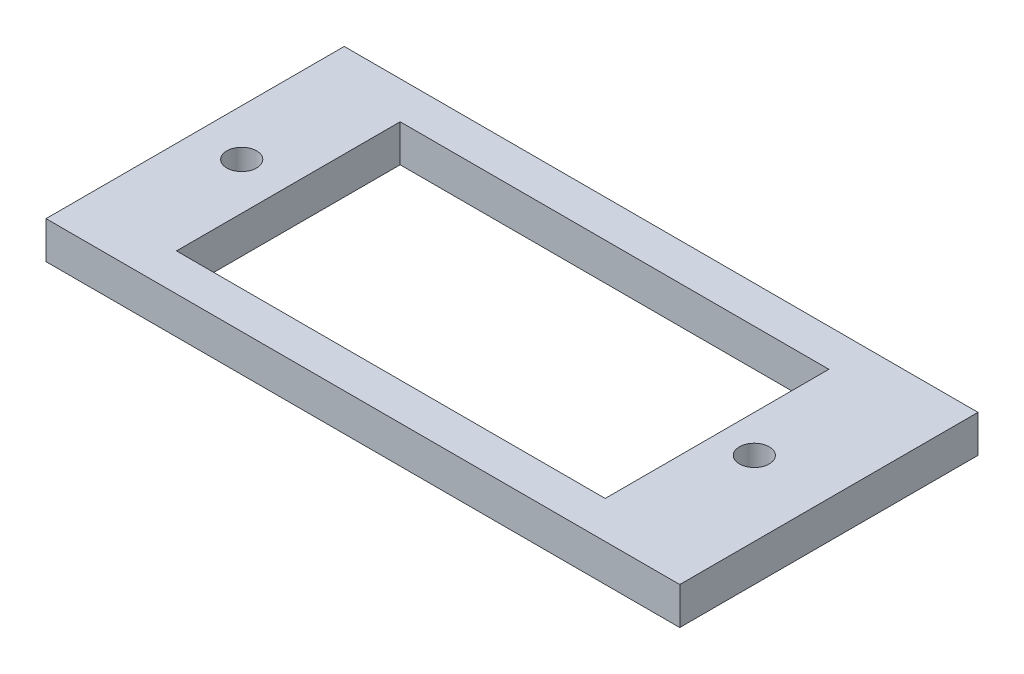
ISO-10303-21;
HEADER;
FILE_DESCRIPTION(('STEP AP214'),'2;1');
FILE_NAME('part.step','',(''),(''),'','','');
FILE_SCHEMA(('AUTOMOTIVE_DESIGN { 1 0 10303 214 1 1 1 1 }'));
ENDSEC;
DATA;
#1=APPLICATION_CONTEXT('core data for automotive mechanical design processes');
#2=APPLICATION_PROTOCOL_DEFINITION('international standard','automotive_design',2000,#1);
#3=PRODUCT_CONTEXT('',#1,'mechanical');
#4=PRODUCT('Part','Part','',(#3));
#5=PRODUCT_RELATED_PRODUCT_CATEGORY('part','',(#4));
#6=PRODUCT_DEFINITION_FORMATION('','',#4);
#7=PRODUCT_DEFINITION_CONTEXT('part definition',#1,'design');
#8=PRODUCT_DEFINITION('design','',#6,#7);
#9=PRODUCT_DEFINITION_SHAPE('','',#8);
#10=(LENGTH_UNIT() NAMED_UNIT(*) SI_UNIT(.MILLI.,.METRE.));
#11=(NAMED_UNIT(*) PLANE_ANGLE_UNIT() SI_UNIT($,.RADIAN.));
#12=(NAMED_UNIT(*) SI_UNIT($,.STERADIAN.) SOLID_ANGLE_UNIT());
#13=UNCERTAINTY_MEASURE_WITH_UNIT(LENGTH_MEASURE(1.E-05),#10,'distance_accuracy_value','');
#14=(GEOMETRIC_REPRESENTATION_CONTEXT(3) GLOBAL_UNCERTAINTY_ASSIGNED_CONTEXT((#13)) GLOBAL_UNIT_ASSIGNED_CONTEXT((#10,
#11,#12)) REPRESENTATION_CONTEXT('',''));
#15=CARTESIAN_POINT('',(0.,0.,0.));
#16=DIRECTION('',(0.,0.,1.));
#17=DIRECTION('',(1.,0.,0.));
#18=AXIS2_PLACEMENT_3D('',#15,#16,#17);
#19=CARTESIAN_POINT('',(-17.,2.,8.));
#20=DIRECTION('',(1.,0.,0.));
#21=DIRECTION('',(0.,0.,-1.));
#22=AXIS2_PLACEMENT_3D('',#19,#20,#21);
#23=PLANE('',#22);
#24=DIRECTION('',(0.,0.,1.));
#25=VECTOR('',#24,1.);
#26=CARTESIAN_POINT('',(-17.,0.,8.));
#27=LINE('',#26,#25);
#28=CARTESIAN_POINT('',(-17.,0.,-8.));
#29=VERTEX_POINT('',#28);
#30=CARTESIAN_POINT('',(-17.,0.,8.));
#31=VERTEX_POINT('',#30);
#32=EDGE_CURVE('E139',#29,#31,#27,.T.);
#33=ORIENTED_EDGE('',*,*,#32,.T.);
#34=DIRECTION('',(0.,-1.,0.));
#35=VECTOR('',#34,1.);
#36=CARTESIAN_POINT('',(-17.,2.,8.));
#37=LINE('',#36,#35);
#38=CARTESIAN_POINT('',(-17.,2.,8.));
#39=VERTEX_POINT('',#38);
#40=EDGE_CURVE('E11',#39,#31,#37,.T.);
#41=ORIENTED_EDGE('',*,*,#40,.F.);
#42=DIRECTION('',(0.,0.,1.));
#43=VECTOR('',#42,1.);
#44=CARTESIAN_POINT('',(-17.,2.,8.));
#45=LINE('',#44,#43);
#46=CARTESIAN_POINT('',(-17.,2.,-8.));
#47=VERTEX_POINT('',#46);
#48=EDGE_CURVE('E140',#47,#39,#45,.T.);
#49=ORIENTED_EDGE('',*,*,#48,.F.);
#50=DIRECTION('',(0.,-1.,0.));
#51=VECTOR('',#50,1.);
#52=CARTESIAN_POINT('',(-17.,2.,-8.));
#53=LINE('',#52,#51);
#54=EDGE_CURVE('E150',#47,#29,#53,.T.);
#55=ORIENTED_EDGE('',*,*,#54,.T.);
#56=EDGE_LOOP('',(#33,#41,#49,#55));
#57=FACE_BOUND('',#56,.T.);
#58=ADVANCED_FACE('F34',(#57),#23,.F.);
#59=CARTESIAN_POINT('',(17.,2.,8.));
#60=DIRECTION('',(0.,0.,-1.));
#61=DIRECTION('',(-1.,0.,0.));
#62=AXIS2_PLACEMENT_3D('',#59,#60,#61);
#63=PLANE('',#62);
#64=DIRECTION('',(1.,0.,0.));
#65=VECTOR('',#64,1.);
#66=CARTESIAN_POINT('',(17.,0.,8.));
#67=LINE('',#66,#65);
#68=CARTESIAN_POINT('',(17.,0.,8.));
#69=VERTEX_POINT('',#68);
#70=EDGE_CURVE('E153',#31,#69,#67,.T.);
#71=ORIENTED_EDGE('',*,*,#70,.T.);
#72=DIRECTION('',(0.,-1.,0.));
#73=VECTOR('',#72,1.);
#74=CARTESIAN_POINT('',(17.,2.,8.));
#75=LINE('',#74,#73);
#76=CARTESIAN_POINT('',(17.,2.,8.));
#77=VERTEX_POINT('',#76);
#78=EDGE_CURVE('E41',#77,#69,#75,.T.);
#79=ORIENTED_EDGE('',*,*,#78,.F.);
#80=DIRECTION('',(1.,0.,0.));
#81=VECTOR('',#80,1.);
#82=CARTESIAN_POINT('',(17.,2.,8.));
#83=LINE('',#82,#81);
#84=EDGE_CURVE('E143',#39,#77,#83,.T.);
#85=ORIENTED_EDGE('',*,*,#84,.F.);
#86=ORIENTED_EDGE('',*,*,#40,.T.);
#87=EDGE_LOOP('',(#71,#79,#85,#86));
#88=FACE_BOUND('',#87,.T.);
#89=ADVANCED_FACE('F181',(#88),#63,.F.);
#90=CARTESIAN_POINT('',(17.,2.,8.));
#91=DIRECTION('',(-1.,0.,0.));
#92=DIRECTION('',(0.,0.,1.));
#93=AXIS2_PLACEMENT_3D('',#90,#91,#92);
#94=PLANE('',#93);
#95=DIRECTION('',(0.,0.,-1.));
#96=VECTOR('',#95,1.);
#97=CARTESIAN_POINT('',(17.,0.,8.));
#98=LINE('',#97,#96);
#99=CARTESIAN_POINT('',(17.,0.,-8.));
#100=VERTEX_POINT('',#99);
#101=EDGE_CURVE('E155',#69,#100,#98,.T.);
#102=ORIENTED_EDGE('',*,*,#101,.T.);
#103=DIRECTION('',(0.,-1.,0.));
#104=VECTOR('',#103,1.);
#105=CARTESIAN_POINT('',(17.,2.,-8.));
#106=LINE('',#105,#104);
#107=CARTESIAN_POINT('',(17.,2.,-8.));
#108=VERTEX_POINT('',#107);
#109=EDGE_CURVE('E160',#108,#100,#106,.T.);
#110=ORIENTED_EDGE('',*,*,#109,.F.);
#111=DIRECTION('',(0.,0.,-1.));
#112=VECTOR('',#111,1.);
#113=CARTESIAN_POINT('',(17.,2.,8.));
#114=LINE('',#113,#112);
#115=EDGE_CURVE('E146',#77,#108,#114,.T.);
#116=ORIENTED_EDGE('',*,*,#115,.F.);
#117=ORIENTED_EDGE('',*,*,#78,.T.);
#118=EDGE_LOOP('',(#102,#110,#116,#117));
#119=FACE_BOUND('',#118,.T.);
#120=ADVANCED_FACE('F167',(#119),#94,.F.);
#121=CARTESIAN_POINT('',(17.,2.,-8.));
#122=DIRECTION('',(0.,0.,1.));
#123=DIRECTION('',(1.,0.,0.));
#124=AXIS2_PLACEMENT_3D('',#121,#122,#123);
#125=PLANE('',#124);
#126=DIRECTION('',(-1.,0.,0.));
#127=VECTOR('',#126,1.);
#128=CARTESIAN_POINT('',(17.,0.,-8.));
#129=LINE('',#128,#127);
#130=EDGE_CURVE('E144',#100,#29,#129,.T.);
#131=ORIENTED_EDGE('',*,*,#130,.T.);
#132=ORIENTED_EDGE('',*,*,#54,.F.);
#133=DIRECTION('',(-1.,0.,0.));
#134=VECTOR('',#133,1.);
#135=CARTESIAN_POINT('',(17.,2.,-8.));
#136=LINE('',#135,#134);
#137=EDGE_CURVE('E148',#108,#47,#136,.T.);
#138=ORIENTED_EDGE('',*,*,#137,.F.);
#139=ORIENTED_EDGE('',*,*,#109,.T.);
#140=EDGE_LOOP('',(#131,#132,#138,#139));
#141=FACE_BOUND('',#140,.T.);
#142=ADVANCED_FACE('F174',(#141),#125,.F.);
#143=CARTESIAN_POINT('',(0.,2.,0.));
#144=DIRECTION('',(0.,1.,0.));
#145=DIRECTION('',(0.,0.,1.));
#146=AXIS2_PLACEMENT_3D('',#143,#144,#145);
#147=PLANE('',#146);
#148=CARTESIAN_POINT('',(12.9999999999999,2.,0.));
#149=DIRECTION('',(0.,1.,0.));
#150=DIRECTION('',(0.,0.,1.));
#151=AXIS2_PLACEMENT_3D('',#148,#149,#150);
#152=CIRCLE('',#151,0.800000000000001);
#153=CARTESIAN_POINT('',(12.9999999999999,2.,0.800000000000001));
#154=VERTEX_POINT('',#153);
#155=EDGE_CURVE('E220',#154,#154,#152,.T.);
#156=ORIENTED_EDGE('',*,*,#155,.F.);
#157=EDGE_LOOP('',(#156));
#158=FACE_BOUND('',#157,.T.);
#159=CARTESIAN_POINT('',(-14.5,2.,0.));
#160=DIRECTION('',(0.,1.,0.));
#161=DIRECTION('',(0.,0.,1.));
#162=AXIS2_PLACEMENT_3D('',#159,#160,#161);
#163=CIRCLE('',#162,0.800000000000001);
#164=CARTESIAN_POINT('',(-14.5,2.,0.800000000000001));
#165=VERTEX_POINT('',#164);
#166=EDGE_CURVE('E117',#165,#165,#163,.T.);
#167=ORIENTED_EDGE('',*,*,#166,.F.);
#168=EDGE_LOOP('',(#167));
#169=FACE_BOUND('',#168,.T.);
#170=DIRECTION('',(0.,0.,1.));
#171=VECTOR('',#170,1.);
#172=CARTESIAN_POINT('',(-12.,2.,0.));
#173=LINE('',#172,#171);
#174=CARTESIAN_POINT('',(-12.,2.,-6.00000000000006));
#175=VERTEX_POINT('',#174);
#176=CARTESIAN_POINT('',(-12.,2.,5.99999999999994));
#177=VERTEX_POINT('',#176);
#178=EDGE_CURVE('E104',#175,#177,#173,.T.);
#179=ORIENTED_EDGE('',*,*,#178,.F.);
#180=DIRECTION('',(-1.,0.,0.));
#181=VECTOR('',#180,1.);
#182=CARTESIAN_POINT('',(0.,2.,-6.00000000000006));
#183=LINE('',#182,#181);
#184=CARTESIAN_POINT('',(11.,2.,-6.00000000000006));
#185=VERTEX_POINT('',#184);
#186=EDGE_CURVE('E136',#185,#175,#183,.T.);
#187=ORIENTED_EDGE('',*,*,#186,.F.);
#188=DIRECTION('',(0.,0.,-1.));
#189=VECTOR('',#188,1.);
#190=CARTESIAN_POINT('',(11.,2.,0.));
#191=LINE('',#190,#189);
#192=CARTESIAN_POINT('',(11.,2.,5.99999999999994));
#193=VERTEX_POINT('',#192);
#194=EDGE_CURVE('E134',#193,#185,#191,.T.);
#195=ORIENTED_EDGE('',*,*,#194,.F.);
#196=DIRECTION('',(1.,0.,0.));
#197=VECTOR('',#196,1.);
#198=CARTESIAN_POINT('',(0.,2.,5.99999999999994));
#199=LINE('',#198,#197);
#200=EDGE_CURVE('E128',#177,#193,#199,.T.);
#201=ORIENTED_EDGE('',*,*,#200,.F.);
#202=EDGE_LOOP('',(#179,#187,#195,#201));
#203=FACE_BOUND('',#202,.T.);
#204=ORIENTED_EDGE('',*,*,#48,.T.);
#205=ORIENTED_EDGE('',*,*,#84,.T.);
#206=ORIENTED_EDGE('',*,*,#115,.T.);
#207=ORIENTED_EDGE('',*,*,#137,.T.);
#208=EDGE_LOOP('',(#204,#205,#206,#207));
#209=FACE_BOUND('',#208,.T.);
#210=ADVANCED_FACE('F180',(#158,#169,#203,#209),#147,.T.);
#211=CARTESIAN_POINT('',(0.,0.,0.));
#212=DIRECTION('',(0.,1.,0.));
#213=DIRECTION('',(0.,0.,1.));
#214=AXIS2_PLACEMENT_3D('',#211,#212,#213);
#215=PLANE('',#214);
#216=CARTESIAN_POINT('',(12.9999999999999,0.,0.));
#217=DIRECTION('',(0.,1.,0.));
#218=DIRECTION('',(0.,0.,1.));
#219=AXIS2_PLACEMENT_3D('',#216,#217,#218);
#220=CIRCLE('',#219,0.800000000000001);
#221=CARTESIAN_POINT('',(12.9999999999999,0.,0.800000000000001));
#222=VERTEX_POINT('',#221);
#223=EDGE_CURVE('E223',#222,#222,#220,.T.);
#224=ORIENTED_EDGE('',*,*,#223,.T.);
#225=EDGE_LOOP('',(#224));
#226=FACE_BOUND('',#225,.T.);
#227=CARTESIAN_POINT('',(-14.5,0.,0.));
#228=DIRECTION('',(0.,1.,0.));
#229=DIRECTION('',(0.,0.,1.));
#230=AXIS2_PLACEMENT_3D('',#227,#228,#229);
#231=CIRCLE('',#230,0.800000000000001);
#232=CARTESIAN_POINT('',(-14.5,0.,0.800000000000001));
#233=VERTEX_POINT('',#232);
#234=EDGE_CURVE('E120',#233,#233,#231,.T.);
#235=ORIENTED_EDGE('',*,*,#234,.T.);
#236=EDGE_LOOP('',(#235));
#237=FACE_BOUND('',#236,.T.);
#238=DIRECTION('',(-1.,0.,0.));
#239=VECTOR('',#238,1.);
#240=CARTESIAN_POINT('',(11.,0.,-6.00000000000006));
#241=LINE('',#240,#239);
#242=CARTESIAN_POINT('',(11.,0.,-6.00000000000006));
#243=VERTEX_POINT('',#242);
#244=CARTESIAN_POINT('',(-12.,0.,-6.00000000000006));
#245=VERTEX_POINT('',#244);
#246=EDGE_CURVE('E107',#243,#245,#241,.T.);
#247=ORIENTED_EDGE('',*,*,#246,.T.);
#248=DIRECTION('',(0.,0.,1.));
#249=VECTOR('',#248,1.);
#250=CARTESIAN_POINT('',(-12.,0.,5.99999999999994));
#251=LINE('',#250,#249);
#252=CARTESIAN_POINT('',(-12.,0.,5.99999999999994));
#253=VERTEX_POINT('',#252);
#254=EDGE_CURVE('E101',#245,#253,#251,.T.);
#255=ORIENTED_EDGE('',*,*,#254,.T.);
#256=DIRECTION('',(1.,0.,0.));
#257=VECTOR('',#256,1.);
#258=CARTESIAN_POINT('',(11.,0.,5.99999999999994));
#259=LINE('',#258,#257);
#260=CARTESIAN_POINT('',(11.,0.,5.99999999999994));
#261=VERTEX_POINT('',#260);
#262=EDGE_CURVE('E110',#253,#261,#259,.T.);
#263=ORIENTED_EDGE('',*,*,#262,.T.);
#264=DIRECTION('',(0.,0.,-1.));
#265=VECTOR('',#264,1.);
#266=CARTESIAN_POINT('',(11.,0.,5.99999999999994));
#267=LINE('',#266,#265);
#268=EDGE_CURVE('E56',#261,#243,#267,.T.);
#269=ORIENTED_EDGE('',*,*,#268,.T.);
#270=EDGE_LOOP('',(#247,#255,#263,#269));
#271=FACE_BOUND('',#270,.T.);
#272=ORIENTED_EDGE('',*,*,#32,.F.);
#273=ORIENTED_EDGE('',*,*,#130,.F.);
#274=ORIENTED_EDGE('',*,*,#101,.F.);
#275=ORIENTED_EDGE('',*,*,#70,.F.);
#276=EDGE_LOOP('',(#272,#273,#274,#275));
#277=FACE_BOUND('',#276,.T.);
#278=ADVANCED_FACE('F114',(#226,#237,#271,#277),#215,.F.);
#279=CARTESIAN_POINT('',(-12.,0.,5.99999999999994));
#280=DIRECTION('',(-1.,0.,0.));
#281=DIRECTION('',(0.,0.,1.));
#282=AXIS2_PLACEMENT_3D('',#279,#280,#281);
#283=PLANE('',#282);
#284=ORIENTED_EDGE('',*,*,#178,.T.);
#285=DIRECTION('',(0.,1.,0.));
#286=VECTOR('',#285,1.);
#287=CARTESIAN_POINT('',(-12.,0.,5.99999999999994));
#288=LINE('',#287,#286);
#289=EDGE_CURVE('E48',#253,#177,#288,.T.);
#290=ORIENTED_EDGE('',*,*,#289,.F.);
#291=ORIENTED_EDGE('',*,*,#254,.F.);
#292=DIRECTION('',(0.,1.,0.));
#293=VECTOR('',#292,1.);
#294=CARTESIAN_POINT('',(-12.,0.,-6.00000000000006));
#295=LINE('',#294,#293);
#296=EDGE_CURVE('E126',#245,#175,#295,.T.);
#297=ORIENTED_EDGE('',*,*,#296,.T.);
#298=EDGE_LOOP('',(#284,#290,#291,#297));
#299=FACE_BOUND('',#298,.T.);
#300=ADVANCED_FACE('F98',(#299),#283,.F.);
#301=CARTESIAN_POINT('',(11.,0.,-6.00000000000006));
#302=DIRECTION('',(0.,0.,-1.));
#303=DIRECTION('',(-1.,0.,0.));
#304=AXIS2_PLACEMENT_3D('',#301,#302,#303);
#305=PLANE('',#304);
#306=ORIENTED_EDGE('',*,*,#186,.T.);
#307=ORIENTED_EDGE('',*,*,#296,.F.);
#308=ORIENTED_EDGE('',*,*,#246,.F.);
#309=DIRECTION('',(0.,1.,0.));
#310=VECTOR('',#309,1.);
#311=CARTESIAN_POINT('',(11.,0.,-6.00000000000006));
#312=LINE('',#311,#310);
#313=EDGE_CURVE('E129',#243,#185,#312,.T.);
#314=ORIENTED_EDGE('',*,*,#313,.T.);
#315=EDGE_LOOP('',(#306,#307,#308,#314));
#316=FACE_BOUND('',#315,.T.);
#317=ADVANCED_FACE('F199',(#316),#305,.F.);
#318=CARTESIAN_POINT('',(11.,0.,5.99999999999994));
#319=DIRECTION('',(1.,0.,0.));
#320=DIRECTION('',(0.,0.,-1.));
#321=AXIS2_PLACEMENT_3D('',#318,#319,#320);
#322=PLANE('',#321);
#323=ORIENTED_EDGE('',*,*,#194,.T.);
#324=ORIENTED_EDGE('',*,*,#313,.F.);
#325=ORIENTED_EDGE('',*,*,#268,.F.);
#326=DIRECTION('',(0.,1.,0.));
#327=VECTOR('',#326,1.);
#328=CARTESIAN_POINT('',(11.,0.,5.99999999999994));
#329=LINE('',#328,#327);
#330=EDGE_CURVE('E106',#261,#193,#329,.T.);
#331=ORIENTED_EDGE('',*,*,#330,.T.);
#332=EDGE_LOOP('',(#323,#324,#325,#331));
#333=FACE_BOUND('',#332,.T.);
#334=ADVANCED_FACE('F203',(#333),#322,.F.);
#335=CARTESIAN_POINT('',(11.,0.,5.99999999999994));
#336=DIRECTION('',(0.,0.,1.));
#337=DIRECTION('',(1.,0.,0.));
#338=AXIS2_PLACEMENT_3D('',#335,#336,#337);
#339=PLANE('',#338);
#340=ORIENTED_EDGE('',*,*,#200,.T.);
#341=ORIENTED_EDGE('',*,*,#330,.F.);
#342=ORIENTED_EDGE('',*,*,#262,.F.);
#343=ORIENTED_EDGE('',*,*,#289,.T.);
#344=EDGE_LOOP('',(#340,#341,#342,#343));
#345=FACE_BOUND('',#344,.T.);
#346=ADVANCED_FACE('F111',(#345),#339,.F.);
#347=CARTESIAN_POINT('',(-14.5,2.,0.));
#348=DIRECTION('',(0.,-1.,0.));
#349=DIRECTION('',(0.,0.,-1.));
#350=AXIS2_PLACEMENT_3D('',#347,#348,#349);
#351=CYLINDRICAL_SURFACE('',#350,0.800000000000001);
#352=ORIENTED_EDGE('',*,*,#166,.T.);
#353=EDGE_LOOP('',(#352));
#354=FACE_BOUND('',#353,.T.);
#355=ORIENTED_EDGE('',*,*,#234,.F.);
#356=EDGE_LOOP('',(#355));
#357=FACE_BOUND('',#356,.T.);
#358=ADVANCED_FACE('F202',(#354,#357),#351,.F.);
#359=CARTESIAN_POINT('',(12.9999999999999,2.,0.));
#360=DIRECTION('',(0.,-1.,0.));
#361=DIRECTION('',(0.,0.,-1.));
#362=AXIS2_PLACEMENT_3D('',#359,#360,#361);
#363=CYLINDRICAL_SURFACE('',#362,0.800000000000001);
#364=ORIENTED_EDGE('',*,*,#155,.T.);
#365=EDGE_LOOP('',(#364));
#366=FACE_BOUND('',#365,.T.);
#367=ORIENTED_EDGE('',*,*,#223,.F.);
#368=EDGE_LOOP('',(#367));
#369=FACE_BOUND('',#368,.T.);
#370=ADVANCED_FACE('F211',(#366,#369),#363,.F.);
#371=CLOSED_SHELL('',(#58,#89,#120,#142,#210,#278,#300,#317,#334,#346,#358,#370));
#372=MANIFOLD_SOLID_BREP('B2',#371);
#373=ADVANCED_BREP_SHAPE_REPRESENTATION('',(#18,#372),#14);
#374=SHAPE_DEFINITION_REPRESENTATION(#9,#373);
ENDSEC;
END-ISO-10303-21;
